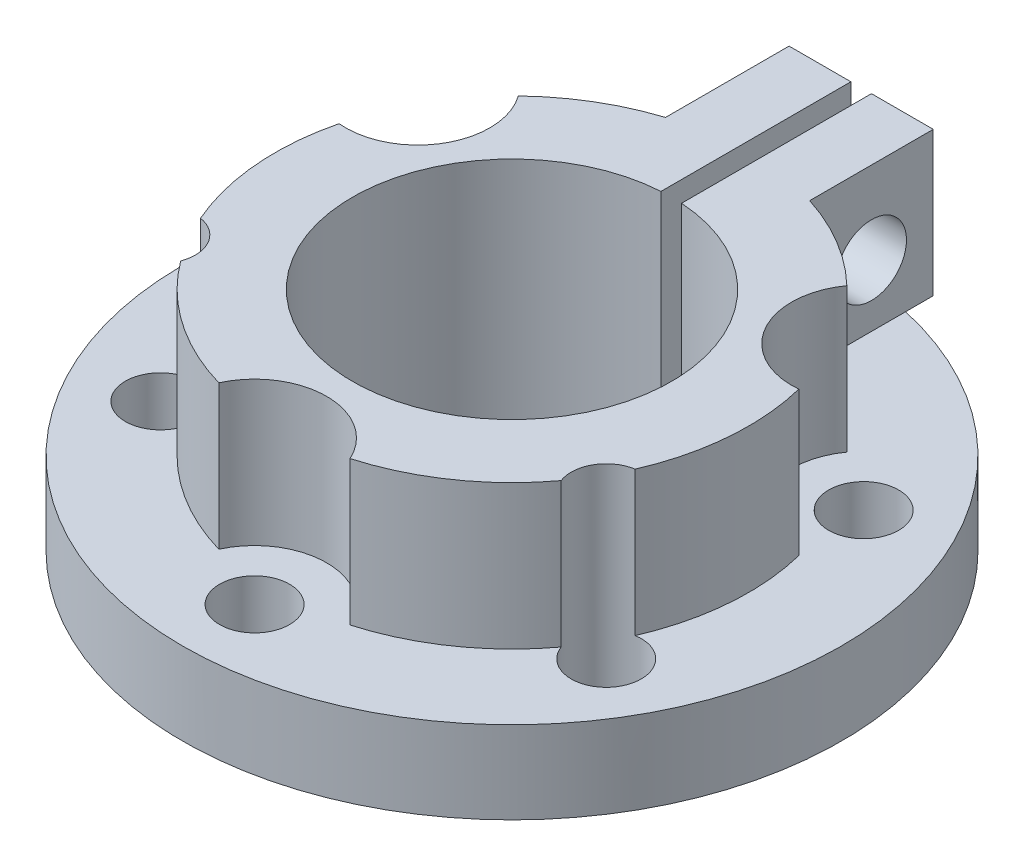
ISO-10303-21;
HEADER;
FILE_DESCRIPTION(('STEP AP214'),'2;1');
FILE_NAME('part.step','',(''),(''),'','','');
FILE_SCHEMA(('AUTOMOTIVE_DESIGN { 1 0 10303 214 1 1 1 1 }'));
ENDSEC;
DATA;
#1=APPLICATION_CONTEXT('core data for automotive mechanical design processes');
#2=APPLICATION_PROTOCOL_DEFINITION('international standard','automotive_design',2000,#1);
#3=PRODUCT_CONTEXT('',#1,'mechanical');
#4=PRODUCT('Part','Part','',(#3));
#5=PRODUCT_RELATED_PRODUCT_CATEGORY('part','',(#4));
#6=PRODUCT_DEFINITION_FORMATION('','',#4);
#7=PRODUCT_DEFINITION_CONTEXT('part definition',#1,'design');
#8=PRODUCT_DEFINITION('design','',#6,#7);
#9=PRODUCT_DEFINITION_SHAPE('','',#8);
#10=(LENGTH_UNIT() NAMED_UNIT(*) SI_UNIT(.MILLI.,.METRE.));
#11=(NAMED_UNIT(*) PLANE_ANGLE_UNIT() SI_UNIT($,.RADIAN.));
#12=(NAMED_UNIT(*) SI_UNIT($,.STERADIAN.) SOLID_ANGLE_UNIT());
#13=UNCERTAINTY_MEASURE_WITH_UNIT(LENGTH_MEASURE(1.E-05),#10,'distance_accuracy_value','');
#14=(GEOMETRIC_REPRESENTATION_CONTEXT(3) GLOBAL_UNCERTAINTY_ASSIGNED_CONTEXT((#13)) GLOBAL_UNIT_ASSIGNED_CONTEXT((#10,
#11,#12)) REPRESENTATION_CONTEXT('',''));
#15=CARTESIAN_POINT('',(0.,0.,0.));
#16=DIRECTION('',(0.,0.,1.));
#17=DIRECTION('',(1.,0.,0.));
#18=AXIS2_PLACEMENT_3D('',#15,#16,#17);
#19=CARTESIAN_POINT('',(0.,4.,-12.5));
#20=DIRECTION('',(0.,-1.,0.));
#21=DIRECTION('',(0.,0.,-1.));
#22=AXIS2_PLACEMENT_3D('',#19,#20,#21);
#23=CYLINDRICAL_SURFACE('',#22,1.7);
#24=DIRECTION('',(0.,1.,0.));
#25=VECTOR('',#24,1.);
#26=CARTESIAN_POINT('',(0.5,0.,-10.8751923190728));
#27=LINE('',#26,#25);
#28=CARTESIAN_POINT('',(0.5,0.,-10.8751923190728));
#29=VERTEX_POINT('',#28);
#30=CARTESIAN_POINT('',(0.5,4.,-10.8751923190728));
#31=VERTEX_POINT('',#30);
#32=EDGE_CURVE('E352',#29,#31,#27,.T.);
#33=ORIENTED_EDGE('',*,*,#32,.T.);
#34=CARTESIAN_POINT('',(0.,4.,-12.5));
#35=DIRECTION('',(0.,1.,0.));
#36=DIRECTION('',(0.,0.,1.));
#37=AXIS2_PLACEMENT_3D('',#34,#35,#36);
#38=CIRCLE('',#37,1.7);
#39=CARTESIAN_POINT('',(0.5,4.,-14.1248076809272));
#40=VERTEX_POINT('',#39);
#41=EDGE_CURVE('E321',#31,#40,#38,.T.);
#42=ORIENTED_EDGE('',*,*,#41,.T.);
#43=DIRECTION('',(0.,-1.,0.));
#44=VECTOR('',#43,1.);
#45=CARTESIAN_POINT('',(0.5,4.,-14.1248076809272));
#46=LINE('',#45,#44);
#47=CARTESIAN_POINT('',(0.5,0.,-14.1248076809272));
#48=VERTEX_POINT('',#47);
#49=EDGE_CURVE('E46',#48,#40,#46,.F.);
#50=ORIENTED_EDGE('',*,*,#49,.F.);
#51=CARTESIAN_POINT('',(0.,0.,-12.5));
#52=DIRECTION('',(0.,1.,0.));
#53=DIRECTION('',(0.,0.,1.));
#54=AXIS2_PLACEMENT_3D('',#51,#52,#53);
#55=CIRCLE('',#54,1.7);
#56=EDGE_CURVE('E326',#29,#48,#55,.T.);
#57=ORIENTED_EDGE('',*,*,#56,.F.);
#58=EDGE_LOOP('',(#33,#42,#50,#57));
#59=FACE_BOUND('',#58,.T.);
#60=ADVANCED_FACE('F38',(#59),#23,.F.);
#61=CARTESIAN_POINT('',(0.,4.,0.));
#62=DIRECTION('',(0.,1.,0.));
#63=DIRECTION('',(0.,0.,1.));
#64=AXIS2_PLACEMENT_3D('',#61,#62,#63);
#65=PLANE('',#64);
#66=DIRECTION('',(0.,0.,1.));
#67=VECTOR('',#66,1.);
#68=CARTESIAN_POINT('',(3.5,4.,0.));
#69=LINE('',#68,#67);
#70=CARTESIAN_POINT('',(3.5,4.,-15.612494995996));
#71=VERTEX_POINT('',#70);
#72=CARTESIAN_POINT('',(3.5,4.,-10.9544511501033));
#73=VERTEX_POINT('',#72);
#74=EDGE_CURVE('E358',#71,#73,#69,.T.);
#75=ORIENTED_EDGE('',*,*,#74,.T.);
#76=CARTESIAN_POINT('',(0.,4.,0.));
#77=DIRECTION('',(0.,1.,0.));
#78=DIRECTION('',(0.,0.,1.));
#79=AXIS2_PLACEMENT_3D('',#76,#77,#78);
#80=CIRCLE('',#79,11.5);
#81=CARTESIAN_POINT('',(7.9768236681987,4.,-8.28373612366214));
#82=VERTEX_POINT('',#81);
#83=EDGE_CURVE('E227',#82,#73,#80,.T.);
#84=ORIENTED_EDGE('',*,*,#83,.F.);
#85=CARTESIAN_POINT('',(10.8253175473057,4.,-6.25000000000046));
#86=DIRECTION('',(0.,1.,0.));
#87=DIRECTION('',(0.,0.,1.));
#88=AXIS2_PLACEMENT_3D('',#85,#86,#87);
#89=CIRCLE('',#88,3.49999999999954);
#90=CARTESIAN_POINT('',(11.1623377554375,4.,-2.76626387633845));
#91=VERTEX_POINT('',#90);
#92=EDGE_CURVE('E436',#82,#91,#89,.T.);
#93=ORIENTED_EDGE('',*,*,#92,.T.);
#94=CARTESIAN_POINT('',(10.5520539858691,4.,4.57210637226475));
#95=VERTEX_POINT('',#94);
#96=EDGE_CURVE('E434',#95,#91,#80,.T.);
#97=ORIENTED_EDGE('',*,*,#96,.F.);
#98=CARTESIAN_POINT('',(10.8253175473063,4.,6.24999999999954));
#99=DIRECTION('',(0.,1.,0.));
#100=DIRECTION('',(0.,0.,1.));
#101=AXIS2_PLACEMENT_3D('',#98,#99,#100);
#102=CIRCLE('',#101,1.70000000000069);
#103=CARTESIAN_POINT('',(9.23558726012141,4.,6.85229362773393));
#104=VERTEX_POINT('',#103);
#105=EDGE_CURVE('E309',#104,#95,#102,.T.);
#106=ORIENTED_EDGE('',*,*,#105,.F.);
#107=CARTESIAN_POINT('',(3.18551408724023,4.,11.0499999999997));
#108=VERTEX_POINT('',#107);
#109=EDGE_CURVE('E432',#108,#104,#80,.T.);
#110=ORIENTED_EDGE('',*,*,#109,.F.);
#111=CARTESIAN_POINT('',(1.06122167814335E-12,4.,12.5));
#112=DIRECTION('',(0.,1.,0.));
#113=DIRECTION('',(0.,0.,1.));
#114=AXIS2_PLACEMENT_3D('',#111,#112,#113);
#115=CIRCLE('',#114,3.5);
#116=CARTESIAN_POINT('',(-3.18551408723836,4.,11.0500000000003));
#117=VERTEX_POINT('',#116);
#118=EDGE_CURVE('E420',#108,#117,#115,.T.);
#119=ORIENTED_EDGE('',*,*,#118,.T.);
#120=CARTESIAN_POINT('',(-9.2355872601199,4.,6.85229362773598));
#121=VERTEX_POINT('',#120);
#122=EDGE_CURVE('E424',#121,#117,#80,.T.);
#123=ORIENTED_EDGE('',*,*,#122,.F.);
#124=CARTESIAN_POINT('',(-10.8253175473047,4.,6.25000000000046));
#125=DIRECTION('',(0.,1.,0.));
#126=DIRECTION('',(0.,0.,1.));
#127=AXIS2_PLACEMENT_3D('',#124,#125,#126);
#128=CIRCLE('',#127,1.70000000000101);
#129=CARTESIAN_POINT('',(-10.5520539858689,4.,4.57210637226511));
#130=VERTEX_POINT('',#129);
#131=EDGE_CURVE('E297',#130,#121,#128,.T.);
#132=ORIENTED_EDGE('',*,*,#131,.F.);
#133=CARTESIAN_POINT('',(-11.1623377554379,4.,-2.76626387633669));
#134=VERTEX_POINT('',#133);
#135=EDGE_CURVE('E438',#134,#130,#80,.T.);
#136=ORIENTED_EDGE('',*,*,#135,.F.);
#137=CARTESIAN_POINT('',(-10.8253175473052,4.,-6.24999999999953));
#138=DIRECTION('',(0.,1.,0.));
#139=DIRECTION('',(0.,0.,1.));
#140=AXIS2_PLACEMENT_3D('',#137,#138,#139);
#141=CIRCLE('',#140,3.50000000000046);
#142=CARTESIAN_POINT('',(-7.97682366819811,4.,-8.28373612366271));
#143=VERTEX_POINT('',#142);
#144=EDGE_CURVE('E265',#134,#143,#141,.T.);
#145=ORIENTED_EDGE('',*,*,#144,.T.);
#146=CARTESIAN_POINT('',(-3.5,4.,-10.9544511501033));
#147=VERTEX_POINT('',#146);
#148=EDGE_CURVE('E435',#147,#143,#80,.T.);
#149=ORIENTED_EDGE('',*,*,#148,.F.);
#150=DIRECTION('',(0.,0.,1.));
#151=VECTOR('',#150,1.);
#152=CARTESIAN_POINT('',(-3.5,4.,0.));
#153=LINE('',#152,#151);
#154=CARTESIAN_POINT('',(-3.5,4.,-15.612494995996));
#155=VERTEX_POINT('',#154);
#156=EDGE_CURVE('E53',#155,#147,#153,.T.);
#157=ORIENTED_EDGE('',*,*,#156,.F.);
#158=CARTESIAN_POINT('',(0.,4.,0.));
#159=DIRECTION('',(0.,1.,0.));
#160=DIRECTION('',(0.,0.,1.));
#161=AXIS2_PLACEMENT_3D('',#158,#159,#160);
#162=CIRCLE('',#161,16.);
#163=EDGE_CURVE('E336',#155,#71,#162,.T.);
#164=ORIENTED_EDGE('',*,*,#163,.T.);
#165=EDGE_LOOP('',(#75,#84,#93,#97,#106,#110,#119,#123,#132,#136,#145,#149,#157,#164));
#166=FACE_BOUND('',#165,.T.);
#167=CARTESIAN_POINT('',(10.8253175473057,4.,-6.25000000000046));
#168=DIRECTION('',(0.,1.,0.));
#169=DIRECTION('',(0.,0.,1.));
#170=AXIS2_PLACEMENT_3D('',#167,#168,#169);
#171=CIRCLE('',#170,1.70000000000015);
#172=CARTESIAN_POINT('',(10.8253175473057,4.,-4.55000000000031));
#173=VERTEX_POINT('',#172);
#174=EDGE_CURVE('E315',#173,#173,#171,.T.);
#175=ORIENTED_EDGE('',*,*,#174,.F.);
#176=EDGE_LOOP('',(#175));
#177=FACE_BOUND('',#176,.T.);
#178=CARTESIAN_POINT('',(1.06122167814335E-12,4.,12.5));
#179=DIRECTION('',(0.,1.,0.));
#180=DIRECTION('',(0.,0.,1.));
#181=AXIS2_PLACEMENT_3D('',#178,#179,#180);
#182=CIRCLE('',#181,1.7000000000011);
#183=CARTESIAN_POINT('',(1.06122167814335E-12,4.,14.2000000000011));
#184=VERTEX_POINT('',#183);
#185=EDGE_CURVE('E303',#184,#184,#182,.T.);
#186=ORIENTED_EDGE('',*,*,#185,.F.);
#187=EDGE_LOOP('',(#186));
#188=FACE_BOUND('',#187,.T.);
#189=CARTESIAN_POINT('',(-10.8253175473052,4.,-6.24999999999953));
#190=DIRECTION('',(0.,1.,0.));
#191=DIRECTION('',(0.,0.,1.));
#192=AXIS2_PLACEMENT_3D('',#189,#190,#191);
#193=CIRCLE('',#192,1.70000000000054);
#194=CARTESIAN_POINT('',(-10.8253175473052,4.,-4.549999999999));
#195=VERTEX_POINT('',#194);
#196=EDGE_CURVE('E291',#195,#195,#193,.T.);
#197=ORIENTED_EDGE('',*,*,#196,.F.);
#198=EDGE_LOOP('',(#197));
#199=FACE_BOUND('',#198,.T.);
#200=ADVANCED_FACE('F443',(#166,#177,#188,#199),#65,.T.);
#201=CARTESIAN_POINT('',(-0.5,4.,-14.1248076809272));
#202=VERTEX_POINT('',#201);
#203=CARTESIAN_POINT('',(-0.5,4.,-10.8751923190728));
#204=VERTEX_POINT('',#203);
#205=EDGE_CURVE('E325',#202,#204,#38,.T.);
#206=ORIENTED_EDGE('',*,*,#205,.T.);
#207=DIRECTION('',(0.,1.,0.));
#208=VECTOR('',#207,1.);
#209=CARTESIAN_POINT('',(-0.5,0.,-10.8751923190728));
#210=LINE('',#209,#208);
#211=CARTESIAN_POINT('',(-0.5,0.,-10.8751923190728));
#212=VERTEX_POINT('',#211);
#213=EDGE_CURVE('E400',#212,#204,#210,.T.);
#214=ORIENTED_EDGE('',*,*,#213,.F.);
#215=CARTESIAN_POINT('',(-0.5,0.,-14.1248076809272));
#216=VERTEX_POINT('',#215);
#217=EDGE_CURVE('E318',#216,#212,#55,.T.);
#218=ORIENTED_EDGE('',*,*,#217,.F.);
#219=DIRECTION('',(0.,-1.,0.));
#220=VECTOR('',#219,1.);
#221=CARTESIAN_POINT('',(-0.5,4.,-14.1248076809272));
#222=LINE('',#221,#220);
#223=EDGE_CURVE('E11',#216,#202,#222,.F.);
#224=ORIENTED_EDGE('',*,*,#223,.T.);
#225=EDGE_LOOP('',(#206,#214,#218,#224));
#226=FACE_BOUND('',#225,.T.);
#227=ADVANCED_FACE('F466',(#226),#23,.F.);
#228=CARTESIAN_POINT('',(0.,11.,0.));
#229=DIRECTION('',(0.,-1.,0.));
#230=DIRECTION('',(0.,0.,-1.));
#231=AXIS2_PLACEMENT_3D('',#228,#229,#230);
#232=CYLINDRICAL_SURFACE('',#231,11.5);
#233=DIRECTION('',(0.,1.,0.));
#234=VECTOR('',#233,1.);
#235=CARTESIAN_POINT('',(-3.5,-2.77918785214442,-10.9544511501033));
#236=LINE('',#235,#234);
#237=CARTESIAN_POINT('',(-3.5,11.,-10.9544511501033));
#238=VERTEX_POINT('',#237);
#239=EDGE_CURVE('E392',#147,#238,#236,.T.);
#240=ORIENTED_EDGE('',*,*,#239,.F.);
#241=ORIENTED_EDGE('',*,*,#148,.T.);
#242=DIRECTION('',(0.,-1.,0.));
#243=VECTOR('',#242,1.);
#244=CARTESIAN_POINT('',(-7.97682366819811,11.,-8.28373612366271));
#245=LINE('',#244,#243);
#246=CARTESIAN_POINT('',(-7.97682366819811,11.,-8.28373612366271));
#247=VERTEX_POINT('',#246);
#248=EDGE_CURVE('E273',#247,#143,#245,.T.);
#249=ORIENTED_EDGE('',*,*,#248,.F.);
#250=CARTESIAN_POINT('',(0.,11.,0.));
#251=DIRECTION('',(0.,1.,0.));
#252=DIRECTION('',(0.,0.,1.));
#253=AXIS2_PLACEMENT_3D('',#250,#251,#252);
#254=CIRCLE('',#253,11.5);
#255=EDGE_CURVE('E61',#238,#247,#254,.T.);
#256=ORIENTED_EDGE('',*,*,#255,.F.);
#257=EDGE_LOOP('',(#240,#241,#249,#256));
#258=FACE_BOUND('',#257,.T.);
#259=ADVANCED_FACE('F459',(#258),#232,.T.);
#260=CARTESIAN_POINT('',(0.,0.,0.));
#261=DIRECTION('',(0.,1.,0.));
#262=DIRECTION('',(0.,0.,1.));
#263=AXIS2_PLACEMENT_3D('',#260,#261,#262);
#264=PLANE('',#263);
#265=CARTESIAN_POINT('',(10.8253175473057,0.,-6.25000000000046));
#266=DIRECTION('',(0.,1.,0.));
#267=DIRECTION('',(0.,0.,1.));
#268=AXIS2_PLACEMENT_3D('',#265,#266,#267);
#269=CIRCLE('',#268,1.70000000000015);
#270=CARTESIAN_POINT('',(10.8253175473057,0.,-4.55000000000031));
#271=VERTEX_POINT('',#270);
#272=EDGE_CURVE('E312',#271,#271,#269,.T.);
#273=ORIENTED_EDGE('',*,*,#272,.T.);
#274=EDGE_LOOP('',(#273));
#275=FACE_BOUND('',#274,.T.);
#276=CARTESIAN_POINT('',(10.8253175473063,0.,6.24999999999954));
#277=DIRECTION('',(0.,1.,0.));
#278=DIRECTION('',(0.,0.,1.));
#279=AXIS2_PLACEMENT_3D('',#276,#277,#278);
#280=CIRCLE('',#279,1.70000000000069);
#281=CARTESIAN_POINT('',(10.8253175473063,0.,7.95000000000023));
#282=VERTEX_POINT('',#281);
#283=EDGE_CURVE('E306',#282,#282,#280,.T.);
#284=ORIENTED_EDGE('',*,*,#283,.T.);
#285=EDGE_LOOP('',(#284));
#286=FACE_BOUND('',#285,.T.);
#287=CARTESIAN_POINT('',(1.06122167814335E-12,0.,12.5));
#288=DIRECTION('',(0.,1.,0.));
#289=DIRECTION('',(0.,0.,1.));
#290=AXIS2_PLACEMENT_3D('',#287,#288,#289);
#291=CIRCLE('',#290,1.7000000000011);
#292=CARTESIAN_POINT('',(1.06122167814335E-12,0.,14.2000000000011));
#293=VERTEX_POINT('',#292);
#294=EDGE_CURVE('E300',#293,#293,#291,.T.);
#295=ORIENTED_EDGE('',*,*,#294,.T.);
#296=EDGE_LOOP('',(#295));
#297=FACE_BOUND('',#296,.T.);
#298=CARTESIAN_POINT('',(-10.8253175473047,0.,6.25000000000046));
#299=DIRECTION('',(0.,1.,0.));
#300=DIRECTION('',(0.,0.,1.));
#301=AXIS2_PLACEMENT_3D('',#298,#299,#300);
#302=CIRCLE('',#301,1.70000000000101);
#303=CARTESIAN_POINT('',(-10.8253175473047,0.,7.95000000000148));
#304=VERTEX_POINT('',#303);
#305=EDGE_CURVE('E294',#304,#304,#302,.T.);
#306=ORIENTED_EDGE('',*,*,#305,.T.);
#307=EDGE_LOOP('',(#306));
#308=FACE_BOUND('',#307,.T.);
#309=CARTESIAN_POINT('',(-10.8253175473052,0.,-6.24999999999953));
#310=DIRECTION('',(0.,1.,0.));
#311=DIRECTION('',(0.,0.,1.));
#312=AXIS2_PLACEMENT_3D('',#309,#310,#311);
#313=CIRCLE('',#312,1.70000000000054);
#314=CARTESIAN_POINT('',(-10.8253175473052,0.,-4.549999999999));
#315=VERTEX_POINT('',#314);
#316=EDGE_CURVE('E290',#315,#315,#313,.T.);
#317=ORIENTED_EDGE('',*,*,#316,.T.);
#318=EDGE_LOOP('',(#317));
#319=FACE_BOUND('',#318,.T.);
#320=DIRECTION('',(0.,0.,-1.));
#321=VECTOR('',#320,1.);
#322=CARTESIAN_POINT('',(-0.5,0.,0.));
#323=LINE('',#322,#321);
#324=CARTESIAN_POINT('',(-0.5,0.,-15.9921855917195));
#325=VERTEX_POINT('',#324);
#326=EDGE_CURVE('E398',#216,#325,#323,.T.);
#327=ORIENTED_EDGE('',*,*,#326,.F.);
#328=ORIENTED_EDGE('',*,*,#217,.T.);
#329=DIRECTION('',(0.,0.,-1.));
#330=VECTOR('',#329,1.);
#331=CARTESIAN_POINT('',(-0.5,0.,0.));
#332=LINE('',#331,#330);
#333=CARTESIAN_POINT('',(-0.5,0.,-7.73385414912901));
#334=VERTEX_POINT('',#333);
#335=EDGE_CURVE('E382',#334,#212,#332,.T.);
#336=ORIENTED_EDGE('',*,*,#335,.F.);
#337=CARTESIAN_POINT('',(0.,0.,0.));
#338=DIRECTION('',(0.,1.,0.));
#339=DIRECTION('',(0.,0.,1.));
#340=AXIS2_PLACEMENT_3D('',#337,#338,#339);
#341=CIRCLE('',#340,7.75);
#342=CARTESIAN_POINT('',(0.5,0.,-7.73385414912901));
#343=VERTEX_POINT('',#342);
#344=EDGE_CURVE('E324',#334,#343,#341,.T.);
#345=ORIENTED_EDGE('',*,*,#344,.T.);
#346=DIRECTION('',(0.,0.,-1.));
#347=VECTOR('',#346,1.);
#348=CARTESIAN_POINT('',(0.5,0.,0.));
#349=LINE('',#348,#347);
#350=EDGE_CURVE('E404',#343,#29,#349,.T.);
#351=ORIENTED_EDGE('',*,*,#350,.T.);
#352=ORIENTED_EDGE('',*,*,#56,.T.);
#353=DIRECTION('',(0.,0.,-1.));
#354=VECTOR('',#353,1.);
#355=CARTESIAN_POINT('',(0.5,0.,0.));
#356=LINE('',#355,#354);
#357=CARTESIAN_POINT('',(0.5,0.,-15.9921855917195));
#358=VERTEX_POINT('',#357);
#359=EDGE_CURVE('E349',#48,#358,#356,.T.);
#360=ORIENTED_EDGE('',*,*,#359,.T.);
#361=CARTESIAN_POINT('',(0.,0.,0.));
#362=DIRECTION('',(0.,1.,0.));
#363=DIRECTION('',(0.,0.,1.));
#364=AXIS2_PLACEMENT_3D('',#361,#362,#363);
#365=CIRCLE('',#364,16.);
#366=EDGE_CURVE('E331',#325,#358,#365,.T.);
#367=ORIENTED_EDGE('',*,*,#366,.F.);
#368=EDGE_LOOP('',(#327,#328,#336,#345,#351,#352,#360,#367));
#369=FACE_BOUND('',#368,.T.);
#370=ADVANCED_FACE('F478',(#275,#286,#297,#308,#319,#369),#264,.F.);
#371=CARTESIAN_POINT('',(0.,4.,0.));
#372=DIRECTION('',(0.,-1.,0.));
#373=DIRECTION('',(0.,0.,-1.));
#374=AXIS2_PLACEMENT_3D('',#371,#372,#373);
#375=CYLINDRICAL_SURFACE('',#374,16.);
#376=DIRECTION('',(0.,-1.,0.));
#377=VECTOR('',#376,1.);
#378=CARTESIAN_POINT('',(-0.5,4.,-15.9921855917195));
#379=LINE('',#378,#377);
#380=CARTESIAN_POINT('',(-0.5,4.,-15.9921855917195));
#381=VERTEX_POINT('',#380);
#382=EDGE_CURVE('E417',#325,#381,#379,.F.);
#383=ORIENTED_EDGE('',*,*,#382,.F.);
#384=ORIENTED_EDGE('',*,*,#366,.T.);
#385=DIRECTION('',(0.,-1.,0.));
#386=VECTOR('',#385,1.);
#387=CARTESIAN_POINT('',(0.5,4.,-15.9921855917195));
#388=LINE('',#387,#386);
#389=CARTESIAN_POINT('',(0.5,4.,-15.9921855917195));
#390=VERTEX_POINT('',#389);
#391=EDGE_CURVE('E414',#358,#390,#388,.F.);
#392=ORIENTED_EDGE('',*,*,#391,.T.);
#393=CARTESIAN_POINT('',(0.,4.,0.));
#394=DIRECTION('',(0.,1.,0.));
#395=DIRECTION('',(0.,0.,1.));
#396=AXIS2_PLACEMENT_3D('',#393,#394,#395);
#397=CIRCLE('',#396,16.);
#398=EDGE_CURVE('E371',#71,#390,#397,.T.);
#399=ORIENTED_EDGE('',*,*,#398,.F.);
#400=ORIENTED_EDGE('',*,*,#163,.F.);
#401=EDGE_CURVE('E332',#381,#155,#162,.T.);
#402=ORIENTED_EDGE('',*,*,#401,.F.);
#403=EDGE_LOOP('',(#383,#384,#392,#399,#400,#402));
#404=FACE_BOUND('',#403,.T.);
#405=ADVANCED_FACE('F40',(#404),#375,.T.);
#406=CARTESIAN_POINT('',(0.,4.,0.));
#407=DIRECTION('',(0.,-1.,0.));
#408=DIRECTION('',(0.,0.,-1.));
#409=AXIS2_PLACEMENT_3D('',#406,#407,#408);
#410=CYLINDRICAL_SURFACE('',#409,7.75);
#411=ORIENTED_EDGE('',*,*,#344,.F.);
#412=DIRECTION('',(0.,-1.,0.));
#413=VECTOR('',#412,1.);
#414=CARTESIAN_POINT('',(-0.5,4.,-7.73385414912901));
#415=LINE('',#414,#413);
#416=CARTESIAN_POINT('',(-0.5,11.,-7.73385414912901));
#417=VERTEX_POINT('',#416);
#418=EDGE_CURVE('E411',#334,#417,#415,.F.);
#419=ORIENTED_EDGE('',*,*,#418,.T.);
#420=CARTESIAN_POINT('',(0.,11.,0.));
#421=DIRECTION('',(0.,1.,0.));
#422=DIRECTION('',(0.,0.,1.));
#423=AXIS2_PLACEMENT_3D('',#420,#421,#422);
#424=CIRCLE('',#423,7.75);
#425=CARTESIAN_POINT('',(0.5,11.,-7.73385414912901));
#426=VERTEX_POINT('',#425);
#427=EDGE_CURVE('E421',#426,#417,#424,.F.);
#428=ORIENTED_EDGE('',*,*,#427,.F.);
#429=DIRECTION('',(0.,-1.,0.));
#430=VECTOR('',#429,1.);
#431=CARTESIAN_POINT('',(0.5,4.,-7.73385414912901));
#432=LINE('',#431,#430);
#433=EDGE_CURVE('E402',#343,#426,#432,.F.);
#434=ORIENTED_EDGE('',*,*,#433,.F.);
#435=EDGE_LOOP('',(#411,#419,#428,#434));
#436=FACE_BOUND('',#435,.T.);
#437=ADVANCED_FACE('F529',(#436),#410,.F.);
#438=CARTESIAN_POINT('',(0.,11.,0.));
#439=DIRECTION('',(0.,1.,0.));
#440=DIRECTION('',(0.,0.,1.));
#441=AXIS2_PLACEMENT_3D('',#438,#439,#440);
#442=PLANE('',#441);
#443=DIRECTION('',(1.,0.,0.));
#444=VECTOR('',#443,1.);
#445=CARTESIAN_POINT('',(0.,11.,-16.9544511501033));
#446=LINE('',#445,#444);
#447=CARTESIAN_POINT('',(0.5,11.,-16.9544511501033));
#448=VERTEX_POINT('',#447);
#449=CARTESIAN_POINT('',(3.5,11.,-16.9544511501033));
#450=VERTEX_POINT('',#449);
#451=EDGE_CURVE('E217',#448,#450,#446,.T.);
#452=ORIENTED_EDGE('',*,*,#451,.F.);
#453=DIRECTION('',(0.,0.,-1.));
#454=VECTOR('',#453,1.);
#455=CARTESIAN_POINT('',(0.5,11.,0.));
#456=LINE('',#455,#454);
#457=EDGE_CURVE('E335',#426,#448,#456,.T.);
#458=ORIENTED_EDGE('',*,*,#457,.F.);
#459=ORIENTED_EDGE('',*,*,#427,.T.);
#460=DIRECTION('',(0.,0.,-1.));
#461=VECTOR('',#460,1.);
#462=CARTESIAN_POINT('',(-0.5,11.,0.));
#463=LINE('',#462,#461);
#464=CARTESIAN_POINT('',(-0.5,11.,-16.9544511501033));
#465=VERTEX_POINT('',#464);
#466=EDGE_CURVE('E340',#417,#465,#463,.T.);
#467=ORIENTED_EDGE('',*,*,#466,.T.);
#468=DIRECTION('',(1.,0.,0.));
#469=VECTOR('',#468,1.);
#470=CARTESIAN_POINT('',(0.,11.,-16.9544511501033));
#471=LINE('',#470,#469);
#472=CARTESIAN_POINT('',(-3.5,11.,-16.9544511501033));
#473=VERTEX_POINT('',#472);
#474=EDGE_CURVE('E374',#473,#465,#471,.T.);
#475=ORIENTED_EDGE('',*,*,#474,.F.);
#476=DIRECTION('',(0.,0.,-1.));
#477=VECTOR('',#476,1.);
#478=CARTESIAN_POINT('',(-3.5,11.,0.));
#479=LINE('',#478,#477);
#480=EDGE_CURVE('E385',#238,#473,#479,.T.);
#481=ORIENTED_EDGE('',*,*,#480,.F.);
#482=ORIENTED_EDGE('',*,*,#255,.T.);
#483=CARTESIAN_POINT('',(-10.8253175473052,11.,-6.24999999999953));
#484=DIRECTION('',(0.,1.,0.));
#485=DIRECTION('',(0.,0.,1.));
#486=AXIS2_PLACEMENT_3D('',#483,#484,#485);
#487=CIRCLE('',#486,3.50000000000046);
#488=CARTESIAN_POINT('',(-11.1623377554379,11.,-2.76626387633669));
#489=VERTEX_POINT('',#488);
#490=EDGE_CURVE('E235',#489,#247,#487,.T.);
#491=ORIENTED_EDGE('',*,*,#490,.F.);
#492=CARTESIAN_POINT('',(-10.5520539858689,11.,4.57210637226511));
#493=VERTEX_POINT('',#492);
#494=EDGE_CURVE('E234',#489,#493,#254,.T.);
#495=ORIENTED_EDGE('',*,*,#494,.T.);
#496=CARTESIAN_POINT('',(-10.8253175473047,11.,6.25000000000046));
#497=DIRECTION('',(0.,1.,0.));
#498=DIRECTION('',(0.,0.,1.));
#499=AXIS2_PLACEMENT_3D('',#496,#497,#498);
#500=CIRCLE('',#499,1.70000000000101);
#501=CARTESIAN_POINT('',(-9.2355872601199,11.,6.85229362773598));
#502=VERTEX_POINT('',#501);
#503=EDGE_CURVE('E243',#493,#502,#500,.F.);
#504=ORIENTED_EDGE('',*,*,#503,.T.);
#505=CARTESIAN_POINT('',(-3.18551408723836,11.,11.0500000000003));
#506=VERTEX_POINT('',#505);
#507=EDGE_CURVE('E236',#502,#506,#254,.T.);
#508=ORIENTED_EDGE('',*,*,#507,.T.);
#509=CARTESIAN_POINT('',(1.06122167814335E-12,11.,12.5));
#510=DIRECTION('',(0.,1.,0.));
#511=DIRECTION('',(0.,0.,1.));
#512=AXIS2_PLACEMENT_3D('',#509,#510,#511);
#513=CIRCLE('',#512,3.5);
#514=CARTESIAN_POINT('',(3.18551408724023,11.,11.0499999999997));
#515=VERTEX_POINT('',#514);
#516=EDGE_CURVE('E423',#515,#506,#513,.T.);
#517=ORIENTED_EDGE('',*,*,#516,.F.);
#518=CARTESIAN_POINT('',(9.23558726012141,11.,6.85229362773393));
#519=VERTEX_POINT('',#518);
#520=EDGE_CURVE('E237',#515,#519,#254,.T.);
#521=ORIENTED_EDGE('',*,*,#520,.T.);
#522=CARTESIAN_POINT('',(10.8253175473063,11.,6.24999999999954));
#523=DIRECTION('',(0.,1.,0.));
#524=DIRECTION('',(0.,0.,1.));
#525=AXIS2_PLACEMENT_3D('',#522,#523,#524);
#526=CIRCLE('',#525,1.70000000000069);
#527=CARTESIAN_POINT('',(10.5520539858691,11.,4.57210637226475));
#528=VERTEX_POINT('',#527);
#529=EDGE_CURVE('E241',#519,#528,#526,.F.);
#530=ORIENTED_EDGE('',*,*,#529,.T.);
#531=CARTESIAN_POINT('',(11.1623377554375,11.,-2.76626387633845));
#532=VERTEX_POINT('',#531);
#533=EDGE_CURVE('E233',#528,#532,#254,.T.);
#534=ORIENTED_EDGE('',*,*,#533,.T.);
#535=CARTESIAN_POINT('',(10.8253175473057,11.,-6.25000000000046));
#536=DIRECTION('',(0.,1.,0.));
#537=DIRECTION('',(0.,0.,1.));
#538=AXIS2_PLACEMENT_3D('',#535,#536,#537);
#539=CIRCLE('',#538,3.49999999999954);
#540=CARTESIAN_POINT('',(7.9768236681987,11.,-8.28373612366214));
#541=VERTEX_POINT('',#540);
#542=EDGE_CURVE('E231',#541,#532,#539,.T.);
#543=ORIENTED_EDGE('',*,*,#542,.F.);
#544=CARTESIAN_POINT('',(3.5,11.,-10.9544511501033));
#545=VERTEX_POINT('',#544);
#546=EDGE_CURVE('E225',#541,#545,#254,.T.);
#547=ORIENTED_EDGE('',*,*,#546,.T.);
#548=DIRECTION('',(0.,0.,-1.));
#549=VECTOR('',#548,1.);
#550=CARTESIAN_POINT('',(3.5,11.,0.));
#551=LINE('',#550,#549);
#552=EDGE_CURVE('E205',#545,#450,#551,.T.);
#553=ORIENTED_EDGE('',*,*,#552,.T.);
#554=EDGE_LOOP('',(#452,#458,#459,#467,#475,#481,#482,#491,#495,#504,#508,#517,#521,#530,#534,
#543,#547,#553));
#555=FACE_BOUND('',#554,.T.);
#556=ADVANCED_FACE('F229',(#555),#442,.T.);
#557=CARTESIAN_POINT('',(10.8253175473057,4.,-6.25000000000046));
#558=DIRECTION('',(0.,-1.,0.));
#559=DIRECTION('',(0.,0.,-1.));
#560=AXIS2_PLACEMENT_3D('',#557,#558,#559);
#561=CYLINDRICAL_SURFACE('',#560,1.70000000000015);
#562=ORIENTED_EDGE('',*,*,#174,.T.);
#563=EDGE_LOOP('',(#562));
#564=FACE_BOUND('',#563,.T.);
#565=ORIENTED_EDGE('',*,*,#272,.F.);
#566=EDGE_LOOP('',(#565));
#567=FACE_BOUND('',#566,.T.);
#568=ADVANCED_FACE('F550',(#564,#567),#561,.F.);
#569=CARTESIAN_POINT('',(10.8253175473063,4.,6.24999999999954));
#570=DIRECTION('',(0.,-1.,0.));
#571=DIRECTION('',(0.,0.,-1.));
#572=AXIS2_PLACEMENT_3D('',#569,#570,#571);
#573=CYLINDRICAL_SURFACE('',#572,1.70000000000069);
#574=ORIENTED_EDGE('',*,*,#105,.T.);
#575=DIRECTION('',(0.,-1.,0.));
#576=VECTOR('',#575,1.);
#577=CARTESIAN_POINT('',(10.5520539858691,11.,4.57210637226475));
#578=LINE('',#577,#576);
#579=EDGE_CURVE('E281',#528,#95,#578,.T.);
#580=ORIENTED_EDGE('',*,*,#579,.F.);
#581=ORIENTED_EDGE('',*,*,#529,.F.);
#582=DIRECTION('',(0.,-1.,0.));
#583=VECTOR('',#582,1.);
#584=CARTESIAN_POINT('',(9.23558726012141,11.,6.85229362773393));
#585=LINE('',#584,#583);
#586=EDGE_CURVE('E284',#519,#104,#585,.T.);
#587=ORIENTED_EDGE('',*,*,#586,.T.);
#588=EDGE_LOOP('',(#574,#580,#581,#587));
#589=FACE_BOUND('',#588,.T.);
#590=ORIENTED_EDGE('',*,*,#283,.F.);
#591=EDGE_LOOP('',(#590));
#592=FACE_BOUND('',#591,.T.);
#593=ADVANCED_FACE('F446',(#589,#592),#573,.F.);
#594=CARTESIAN_POINT('',(1.06122167814335E-12,4.,12.5));
#595=DIRECTION('',(0.,-1.,0.));
#596=DIRECTION('',(0.,0.,-1.));
#597=AXIS2_PLACEMENT_3D('',#594,#595,#596);
#598=CYLINDRICAL_SURFACE('',#597,1.7000000000011);
#599=ORIENTED_EDGE('',*,*,#185,.T.);
#600=EDGE_LOOP('',(#599));
#601=FACE_BOUND('',#600,.T.);
#602=ORIENTED_EDGE('',*,*,#294,.F.);
#603=EDGE_LOOP('',(#602));
#604=FACE_BOUND('',#603,.T.);
#605=ADVANCED_FACE('F601',(#601,#604),#598,.F.);
#606=CARTESIAN_POINT('',(-10.8253175473047,4.,6.25000000000046));
#607=DIRECTION('',(0.,-1.,0.));
#608=DIRECTION('',(0.,0.,-1.));
#609=AXIS2_PLACEMENT_3D('',#606,#607,#608);
#610=CYLINDRICAL_SURFACE('',#609,1.70000000000101);
#611=ORIENTED_EDGE('',*,*,#131,.T.);
#612=DIRECTION('',(0.,-1.,0.));
#613=VECTOR('',#612,1.);
#614=CARTESIAN_POINT('',(-9.2355872601199,11.,6.85229362773598));
#615=LINE('',#614,#613);
#616=EDGE_CURVE('E255',#502,#121,#615,.T.);
#617=ORIENTED_EDGE('',*,*,#616,.F.);
#618=ORIENTED_EDGE('',*,*,#503,.F.);
#619=DIRECTION('',(0.,-1.,0.));
#620=VECTOR('',#619,1.);
#621=CARTESIAN_POINT('',(-10.5520539858689,11.,4.57210637226511));
#622=LINE('',#621,#620);
#623=EDGE_CURVE('E262',#493,#130,#622,.T.);
#624=ORIENTED_EDGE('',*,*,#623,.T.);
#625=EDGE_LOOP('',(#611,#617,#618,#624));
#626=FACE_BOUND('',#625,.T.);
#627=ORIENTED_EDGE('',*,*,#305,.F.);
#628=EDGE_LOOP('',(#627));
#629=FACE_BOUND('',#628,.T.);
#630=ADVANCED_FACE('F460',(#626,#629),#610,.F.);
#631=CARTESIAN_POINT('',(-10.8253175473052,4.,-6.24999999999953));
#632=DIRECTION('',(0.,-1.,0.));
#633=DIRECTION('',(0.,0.,-1.));
#634=AXIS2_PLACEMENT_3D('',#631,#632,#633);
#635=CYLINDRICAL_SURFACE('',#634,1.70000000000054);
#636=ORIENTED_EDGE('',*,*,#196,.T.);
#637=EDGE_LOOP('',(#636));
#638=FACE_BOUND('',#637,.T.);
#639=ORIENTED_EDGE('',*,*,#316,.F.);
#640=EDGE_LOOP('',(#639));
#641=FACE_BOUND('',#640,.T.);
#642=ADVANCED_FACE('F452',(#638,#641),#635,.F.);
#643=CARTESIAN_POINT('',(1.06122167814335E-12,11.,12.5));
#644=DIRECTION('',(0.,-1.,0.));
#645=DIRECTION('',(0.,0.,-1.));
#646=AXIS2_PLACEMENT_3D('',#643,#644,#645);
#647=CYLINDRICAL_SURFACE('',#646,3.5);
#648=ORIENTED_EDGE('',*,*,#118,.F.);
#649=DIRECTION('',(0.,-1.,0.));
#650=VECTOR('',#649,1.);
#651=CARTESIAN_POINT('',(3.18551408724023,11.,11.0499999999997));
#652=LINE('',#651,#650);
#653=EDGE_CURVE('E287',#515,#108,#652,.T.);
#654=ORIENTED_EDGE('',*,*,#653,.F.);
#655=ORIENTED_EDGE('',*,*,#516,.T.);
#656=DIRECTION('',(0.,-1.,0.));
#657=VECTOR('',#656,1.);
#658=CARTESIAN_POINT('',(-3.18551408723836,11.,11.0500000000003));
#659=LINE('',#658,#657);
#660=EDGE_CURVE('E251',#506,#117,#659,.T.);
#661=ORIENTED_EDGE('',*,*,#660,.T.);
#662=EDGE_LOOP('',(#648,#654,#655,#661));
#663=FACE_BOUND('',#662,.T.);
#664=ADVANCED_FACE('F450',(#663),#647,.F.);
#665=ORIENTED_EDGE('',*,*,#109,.T.);
#666=ORIENTED_EDGE('',*,*,#586,.F.);
#667=ORIENTED_EDGE('',*,*,#520,.F.);
#668=ORIENTED_EDGE('',*,*,#653,.T.);
#669=EDGE_LOOP('',(#665,#666,#667,#668));
#670=FACE_BOUND('',#669,.T.);
#671=ADVANCED_FACE('F449',(#670),#232,.T.);
#672=ORIENTED_EDGE('',*,*,#96,.T.);
#673=DIRECTION('',(0.,-1.,0.));
#674=VECTOR('',#673,1.);
#675=CARTESIAN_POINT('',(11.1623377554375,11.,-2.76626387633845));
#676=LINE('',#675,#674);
#677=EDGE_CURVE('E278',#532,#91,#676,.T.);
#678=ORIENTED_EDGE('',*,*,#677,.F.);
#679=ORIENTED_EDGE('',*,*,#533,.F.);
#680=ORIENTED_EDGE('',*,*,#579,.T.);
#681=EDGE_LOOP('',(#672,#678,#679,#680));
#682=FACE_BOUND('',#681,.T.);
#683=ADVANCED_FACE('F442',(#682),#232,.T.);
#684=CARTESIAN_POINT('',(10.8253175473057,11.,-6.25000000000046));
#685=DIRECTION('',(0.,-1.,0.));
#686=DIRECTION('',(0.,0.,-1.));
#687=AXIS2_PLACEMENT_3D('',#684,#685,#686);
#688=CYLINDRICAL_SURFACE('',#687,3.49999999999954);
#689=ORIENTED_EDGE('',*,*,#92,.F.);
#690=DIRECTION('',(0.,-1.,0.));
#691=VECTOR('',#690,1.);
#692=CARTESIAN_POINT('',(7.9768236681987,11.,-8.28373612366214));
#693=LINE('',#692,#691);
#694=EDGE_CURVE('E276',#541,#82,#693,.T.);
#695=ORIENTED_EDGE('',*,*,#694,.F.);
#696=ORIENTED_EDGE('',*,*,#542,.T.);
#697=ORIENTED_EDGE('',*,*,#677,.T.);
#698=EDGE_LOOP('',(#689,#695,#696,#697));
#699=FACE_BOUND('',#698,.T.);
#700=ADVANCED_FACE('F535',(#699),#688,.F.);
#701=ORIENTED_EDGE('',*,*,#83,.T.);
#702=DIRECTION('',(0.,1.,0.));
#703=VECTOR('',#702,1.);
#704=CARTESIAN_POINT('',(3.5,-2.77918785214442,-10.9544511501033));
#705=LINE('',#704,#703);
#706=EDGE_CURVE('E209',#73,#545,#705,.T.);
#707=ORIENTED_EDGE('',*,*,#706,.T.);
#708=ORIENTED_EDGE('',*,*,#546,.F.);
#709=ORIENTED_EDGE('',*,*,#694,.T.);
#710=EDGE_LOOP('',(#701,#707,#708,#709));
#711=FACE_BOUND('',#710,.T.);
#712=ADVANCED_FACE('F223',(#711),#232,.T.);
#713=CARTESIAN_POINT('',(-10.8253175473052,11.,-6.24999999999953));
#714=DIRECTION('',(0.,-1.,0.));
#715=DIRECTION('',(0.,0.,-1.));
#716=AXIS2_PLACEMENT_3D('',#713,#714,#715);
#717=CYLINDRICAL_SURFACE('',#716,3.50000000000046);
#718=ORIENTED_EDGE('',*,*,#144,.F.);
#719=DIRECTION('',(0.,-1.,0.));
#720=VECTOR('',#719,1.);
#721=CARTESIAN_POINT('',(-11.1623377554379,11.,-2.76626387633669));
#722=LINE('',#721,#720);
#723=EDGE_CURVE('E270',#489,#134,#722,.T.);
#724=ORIENTED_EDGE('',*,*,#723,.F.);
#725=ORIENTED_EDGE('',*,*,#490,.T.);
#726=ORIENTED_EDGE('',*,*,#248,.T.);
#727=EDGE_LOOP('',(#718,#724,#725,#726));
#728=FACE_BOUND('',#727,.T.);
#729=ADVANCED_FACE('F541',(#728),#717,.F.);
#730=ORIENTED_EDGE('',*,*,#135,.T.);
#731=ORIENTED_EDGE('',*,*,#623,.F.);
#732=ORIENTED_EDGE('',*,*,#494,.F.);
#733=ORIENTED_EDGE('',*,*,#723,.T.);
#734=EDGE_LOOP('',(#730,#731,#732,#733));
#735=FACE_BOUND('',#734,.T.);
#736=ADVANCED_FACE('F542',(#735),#232,.T.);
#737=ORIENTED_EDGE('',*,*,#122,.T.);
#738=ORIENTED_EDGE('',*,*,#660,.F.);
#739=ORIENTED_EDGE('',*,*,#507,.F.);
#740=ORIENTED_EDGE('',*,*,#616,.T.);
#741=EDGE_LOOP('',(#737,#738,#739,#740));
#742=FACE_BOUND('',#741,.T.);
#743=ADVANCED_FACE('F479',(#742),#232,.T.);
#744=CARTESIAN_POINT('',(0.5,0.,0.));
#745=DIRECTION('',(1.,0.,0.));
#746=DIRECTION('',(0.,0.,-1.));
#747=AXIS2_PLACEMENT_3D('',#744,#745,#746);
#748=PLANE('',#747);
#749=CARTESIAN_POINT('',(0.5,7.,-13.9544511501033));
#750=DIRECTION('',(1.,0.,0.));
#751=DIRECTION('',(0.,0.,-1.));
#752=AXIS2_PLACEMENT_3D('',#749,#750,#751);
#753=CIRCLE('',#752,1.7);
#754=CARTESIAN_POINT('',(0.5,7.,-15.6544511501033));
#755=VERTEX_POINT('',#754);
#756=EDGE_CURVE('E218',#755,#755,#753,.T.);
#757=ORIENTED_EDGE('',*,*,#756,.T.);
#758=EDGE_LOOP('',(#757));
#759=FACE_BOUND('',#758,.T.);
#760=ORIENTED_EDGE('',*,*,#359,.F.);
#761=ORIENTED_EDGE('',*,*,#49,.T.);
#762=DIRECTION('',(0.,0.,1.));
#763=VECTOR('',#762,1.);
#764=CARTESIAN_POINT('',(0.5,4.,0.));
#765=LINE('',#764,#763);
#766=EDGE_CURVE('E346',#40,#31,#765,.T.);
#767=ORIENTED_EDGE('',*,*,#766,.T.);
#768=ORIENTED_EDGE('',*,*,#32,.F.);
#769=ORIENTED_EDGE('',*,*,#350,.F.);
#770=ORIENTED_EDGE('',*,*,#433,.T.);
#771=ORIENTED_EDGE('',*,*,#457,.T.);
#772=DIRECTION('',(0.,1.,0.));
#773=VECTOR('',#772,1.);
#774=CARTESIAN_POINT('',(0.5,-2.77918785214442,-16.9544511501033));
#775=LINE('',#774,#773);
#776=CARTESIAN_POINT('',(0.5,4.,-16.9544511501033));
#777=VERTEX_POINT('',#776);
#778=EDGE_CURVE('E360',#777,#448,#775,.T.);
#779=ORIENTED_EDGE('',*,*,#778,.F.);
#780=EDGE_CURVE('E355',#777,#390,#765,.T.);
#781=ORIENTED_EDGE('',*,*,#780,.T.);
#782=ORIENTED_EDGE('',*,*,#391,.F.);
#783=EDGE_LOOP('',(#760,#761,#767,#768,#769,#770,#771,#779,#781,#782));
#784=FACE_BOUND('',#783,.T.);
#785=ADVANCED_FACE('F345',(#759,#784),#748,.F.);
#786=CARTESIAN_POINT('',(-0.5,0.,0.));
#787=DIRECTION('',(1.,0.,0.));
#788=DIRECTION('',(0.,0.,-1.));
#789=AXIS2_PLACEMENT_3D('',#786,#787,#788);
#790=PLANE('',#789);
#791=CARTESIAN_POINT('',(-0.5,7.,-13.9544511501033));
#792=DIRECTION('',(1.,0.,0.));
#793=DIRECTION('',(0.,0.,-1.));
#794=AXIS2_PLACEMENT_3D('',#791,#792,#793);
#795=CIRCLE('',#794,1.7);
#796=CARTESIAN_POINT('',(-0.5,7.,-15.6544511501033));
#797=VERTEX_POINT('',#796);
#798=EDGE_CURVE('E559',#797,#797,#795,.T.);
#799=ORIENTED_EDGE('',*,*,#798,.F.);
#800=EDGE_LOOP('',(#799));
#801=FACE_BOUND('',#800,.T.);
#802=ORIENTED_EDGE('',*,*,#382,.T.);
#803=DIRECTION('',(0.,0.,1.));
#804=VECTOR('',#803,1.);
#805=CARTESIAN_POINT('',(-0.5,4.,0.));
#806=LINE('',#805,#804);
#807=CARTESIAN_POINT('',(-0.5,4.,-16.9544511501033));
#808=VERTEX_POINT('',#807);
#809=EDGE_CURVE('E375',#808,#381,#806,.T.);
#810=ORIENTED_EDGE('',*,*,#809,.F.);
#811=DIRECTION('',(0.,1.,0.));
#812=VECTOR('',#811,1.);
#813=CARTESIAN_POINT('',(-0.5,-2.77918785214442,-16.9544511501033));
#814=LINE('',#813,#812);
#815=EDGE_CURVE('E389',#808,#465,#814,.T.);
#816=ORIENTED_EDGE('',*,*,#815,.T.);
#817=ORIENTED_EDGE('',*,*,#466,.F.);
#818=ORIENTED_EDGE('',*,*,#418,.F.);
#819=ORIENTED_EDGE('',*,*,#335,.T.);
#820=ORIENTED_EDGE('',*,*,#213,.T.);
#821=EDGE_CURVE('E379',#202,#204,#806,.T.);
#822=ORIENTED_EDGE('',*,*,#821,.F.);
#823=ORIENTED_EDGE('',*,*,#223,.F.);
#824=ORIENTED_EDGE('',*,*,#326,.T.);
#825=EDGE_LOOP('',(#802,#810,#816,#817,#818,#819,#820,#822,#823,#824));
#826=FACE_BOUND('',#825,.T.);
#827=ADVANCED_FACE('F488',(#801,#826),#790,.T.);
#828=CARTESIAN_POINT('',(0.,4.,0.));
#829=DIRECTION('',(0.,1.,0.));
#830=DIRECTION('',(0.,0.,1.));
#831=AXIS2_PLACEMENT_3D('',#828,#829,#830);
#832=PLANE('',#831);
#833=ORIENTED_EDGE('',*,*,#809,.T.);
#834=ORIENTED_EDGE('',*,*,#401,.T.);
#835=CARTESIAN_POINT('',(-3.5,4.,-16.9544511501033));
#836=VERTEX_POINT('',#835);
#837=EDGE_CURVE('E395',#836,#155,#153,.T.);
#838=ORIENTED_EDGE('',*,*,#837,.F.);
#839=DIRECTION('',(-1.,0.,0.));
#840=VECTOR('',#839,1.);
#841=CARTESIAN_POINT('',(0.,4.,-16.9544511501033));
#842=LINE('',#841,#840);
#843=EDGE_CURVE('E378',#808,#836,#842,.T.);
#844=ORIENTED_EDGE('',*,*,#843,.F.);
#845=EDGE_LOOP('',(#833,#834,#838,#844));
#846=FACE_BOUND('',#845,.T.);
#847=ADVANCED_FACE('F495',(#846),#832,.F.);
#848=CARTESIAN_POINT('',(-3.5,-2.77918785214442,0.));
#849=DIRECTION('',(1.,0.,0.));
#850=DIRECTION('',(0.,0.,-1.));
#851=AXIS2_PLACEMENT_3D('',#848,#849,#850);
#852=PLANE('',#851);
#853=CARTESIAN_POINT('',(-3.5,7.,-13.9544511501033));
#854=DIRECTION('',(1.,0.,0.));
#855=DIRECTION('',(0.,0.,-1.));
#856=AXIS2_PLACEMENT_3D('',#853,#854,#855);
#857=CIRCLE('',#856,1.7);
#858=CARTESIAN_POINT('',(-3.5,7.,-15.6544511501033));
#859=VERTEX_POINT('',#858);
#860=EDGE_CURVE('E561',#859,#859,#857,.T.);
#861=ORIENTED_EDGE('',*,*,#860,.T.);
#862=EDGE_LOOP('',(#861));
#863=FACE_BOUND('',#862,.T.);
#864=DIRECTION('',(0.,1.,0.));
#865=VECTOR('',#864,1.);
#866=CARTESIAN_POINT('',(-3.5,-2.77918785214442,-16.9544511501033));
#867=LINE('',#866,#865);
#868=EDGE_CURVE('E388',#836,#473,#867,.T.);
#869=ORIENTED_EDGE('',*,*,#868,.F.);
#870=ORIENTED_EDGE('',*,*,#837,.T.);
#871=ORIENTED_EDGE('',*,*,#156,.T.);
#872=ORIENTED_EDGE('',*,*,#239,.T.);
#873=ORIENTED_EDGE('',*,*,#480,.T.);
#874=EDGE_LOOP('',(#869,#870,#871,#872,#873));
#875=FACE_BOUND('',#874,.T.);
#876=ADVANCED_FACE('F503',(#863,#875),#852,.F.);
#877=CARTESIAN_POINT('',(0.,-2.77918785214442,-16.9544511501033));
#878=DIRECTION('',(0.,0.,1.));
#879=DIRECTION('',(1.,0.,0.));
#880=AXIS2_PLACEMENT_3D('',#877,#878,#879);
#881=PLANE('',#880);
#882=ORIENTED_EDGE('',*,*,#815,.F.);
#883=ORIENTED_EDGE('',*,*,#843,.T.);
#884=ORIENTED_EDGE('',*,*,#868,.T.);
#885=ORIENTED_EDGE('',*,*,#474,.T.);
#886=EDGE_LOOP('',(#882,#883,#884,#885));
#887=FACE_BOUND('',#886,.T.);
#888=ADVANCED_FACE('F493',(#887),#881,.F.);
#889=ORIENTED_EDGE('',*,*,#205,.F.);
#890=ORIENTED_EDGE('',*,*,#821,.T.);
#891=EDGE_LOOP('',(#889,#890));
#892=FACE_BOUND('',#891,.T.);
#893=ADVANCED_FACE('F490',(#892),#832,.F.);
#894=CARTESIAN_POINT('',(0.,4.,0.));
#895=DIRECTION('',(0.,1.,0.));
#896=DIRECTION('',(0.,0.,1.));
#897=AXIS2_PLACEMENT_3D('',#894,#895,#896);
#898=PLANE('',#897);
#899=CARTESIAN_POINT('',(3.5,4.,-16.9544511501033));
#900=VERTEX_POINT('',#899);
#901=EDGE_CURVE('E368',#900,#71,#69,.T.);
#902=ORIENTED_EDGE('',*,*,#901,.T.);
#903=ORIENTED_EDGE('',*,*,#398,.T.);
#904=ORIENTED_EDGE('',*,*,#780,.F.);
#905=DIRECTION('',(-1.,0.,0.));
#906=VECTOR('',#905,1.);
#907=CARTESIAN_POINT('',(0.,4.,-16.9544511501033));
#908=LINE('',#907,#906);
#909=EDGE_CURVE('E356',#900,#777,#908,.T.);
#910=ORIENTED_EDGE('',*,*,#909,.F.);
#911=EDGE_LOOP('',(#902,#903,#904,#910));
#912=FACE_BOUND('',#911,.T.);
#913=ADVANCED_FACE('F492',(#912),#898,.F.);
#914=CARTESIAN_POINT('',(0.,-2.77918785214442,-16.9544511501033));
#915=DIRECTION('',(0.,0.,1.));
#916=DIRECTION('',(1.,0.,0.));
#917=AXIS2_PLACEMENT_3D('',#914,#915,#916);
#918=PLANE('',#917);
#919=DIRECTION('',(0.,1.,0.));
#920=VECTOR('',#919,1.);
#921=CARTESIAN_POINT('',(3.5,-2.77918785214442,-16.9544511501033));
#922=LINE('',#921,#920);
#923=EDGE_CURVE('E212',#900,#450,#922,.T.);
#924=ORIENTED_EDGE('',*,*,#923,.F.);
#925=ORIENTED_EDGE('',*,*,#909,.T.);
#926=ORIENTED_EDGE('',*,*,#778,.T.);
#927=ORIENTED_EDGE('',*,*,#451,.T.);
#928=EDGE_LOOP('',(#924,#925,#926,#927));
#929=FACE_BOUND('',#928,.T.);
#930=ADVANCED_FACE('F500',(#929),#918,.F.);
#931=CARTESIAN_POINT('',(3.5,-2.77918785214442,0.));
#932=DIRECTION('',(1.,0.,0.));
#933=DIRECTION('',(0.,0.,-1.));
#934=AXIS2_PLACEMENT_3D('',#931,#932,#933);
#935=PLANE('',#934);
#936=CARTESIAN_POINT('',(3.5,7.,-13.9544511501033));
#937=DIRECTION('',(1.,0.,0.));
#938=DIRECTION('',(0.,0.,-1.));
#939=AXIS2_PLACEMENT_3D('',#936,#937,#938);
#940=CIRCLE('',#939,1.7);
#941=CARTESIAN_POINT('',(3.5,7.,-15.6544511501033));
#942=VERTEX_POINT('',#941);
#943=EDGE_CURVE('E566',#942,#942,#940,.T.);
#944=ORIENTED_EDGE('',*,*,#943,.F.);
#945=EDGE_LOOP('',(#944));
#946=FACE_BOUND('',#945,.T.);
#947=ORIENTED_EDGE('',*,*,#901,.F.);
#948=ORIENTED_EDGE('',*,*,#923,.T.);
#949=ORIENTED_EDGE('',*,*,#552,.F.);
#950=ORIENTED_EDGE('',*,*,#706,.F.);
#951=ORIENTED_EDGE('',*,*,#74,.F.);
#952=EDGE_LOOP('',(#947,#948,#949,#950,#951));
#953=FACE_BOUND('',#952,.T.);
#954=ADVANCED_FACE('F208',(#946,#953),#935,.T.);
#955=ORIENTED_EDGE('',*,*,#41,.F.);
#956=ORIENTED_EDGE('',*,*,#766,.F.);
#957=EDGE_LOOP('',(#955,#956));
#958=FACE_BOUND('',#957,.T.);
#959=ADVANCED_FACE('F354',(#958),#898,.F.);
#960=CARTESIAN_POINT('',(-4.5,7.,-13.9544511501033));
#961=DIRECTION('',(1.,0.,0.));
#962=DIRECTION('',(0.,0.,-1.));
#963=AXIS2_PLACEMENT_3D('',#960,#961,#962);
#964=CYLINDRICAL_SURFACE('',#963,1.7);
#965=ORIENTED_EDGE('',*,*,#943,.T.);
#966=EDGE_LOOP('',(#965));
#967=FACE_BOUND('',#966,.T.);
#968=ORIENTED_EDGE('',*,*,#756,.F.);
#969=EDGE_LOOP('',(#968));
#970=FACE_BOUND('',#969,.T.);
#971=ADVANCED_FACE('F570',(#967,#970),#964,.F.);
#972=ORIENTED_EDGE('',*,*,#798,.T.);
#973=EDGE_LOOP('',(#972));
#974=FACE_BOUND('',#973,.T.);
#975=ORIENTED_EDGE('',*,*,#860,.F.);
#976=EDGE_LOOP('',(#975));
#977=FACE_BOUND('',#976,.T.);
#978=ADVANCED_FACE('F580',(#974,#977),#964,.F.);
#979=CLOSED_SHELL('',(#60,#200,#227,#259,#370,#405,#437,#556,#568,#593,#605,#630,#642,#664,#671,
#683,#700,#712,#729,#736,#743,#785,#827,#847,#876,#888,#893,#913,#930,#954,#959,#971,#978));
#980=MANIFOLD_SOLID_BREP('B2',#979);
#981=ADVANCED_BREP_SHAPE_REPRESENTATION('',(#18,#980),#14);
#982=SHAPE_DEFINITION_REPRESENTATION(#9,#981);
ENDSEC;
END-ISO-10303-21;
